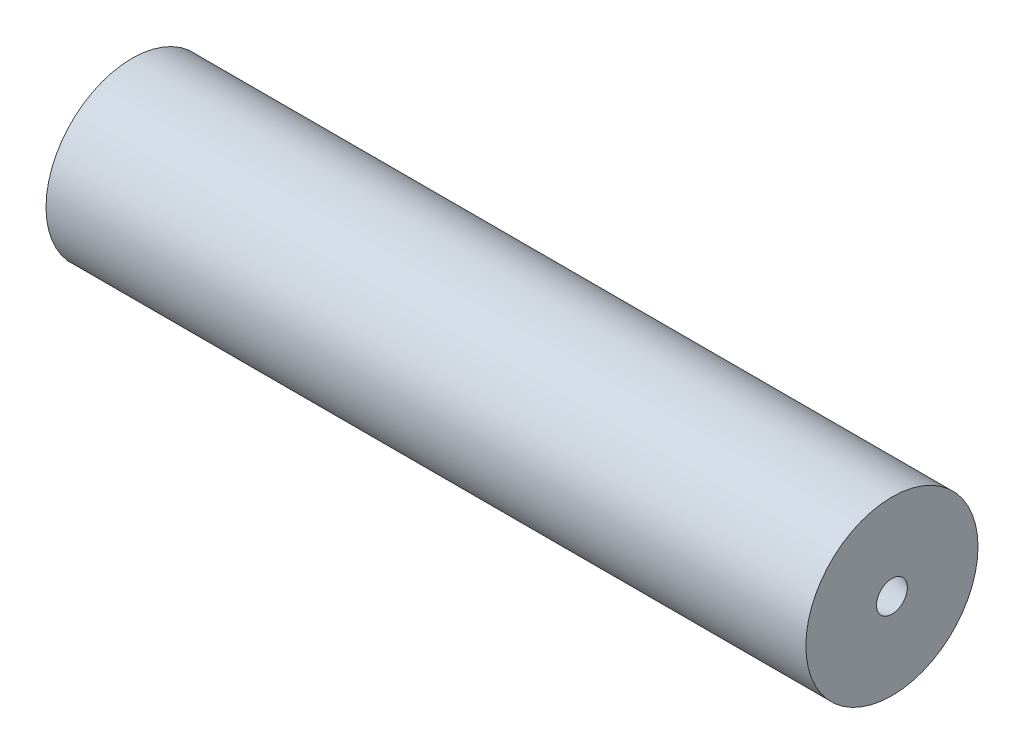
ISO-10303-21;
HEADER;
FILE_DESCRIPTION(('STEP AP214'),'2;1');
FILE_NAME('part.step','',(''),(''),'','','');
FILE_SCHEMA(('AUTOMOTIVE_DESIGN { 1 0 10303 214 1 1 1 1 }'));
ENDSEC;
DATA;
#1=APPLICATION_CONTEXT('core data for automotive mechanical design processes');
#2=APPLICATION_PROTOCOL_DEFINITION('international standard','automotive_design',2000,#1);
#3=PRODUCT_CONTEXT('',#1,'mechanical');
#4=PRODUCT('Part','Part','',(#3));
#5=PRODUCT_RELATED_PRODUCT_CATEGORY('part','',(#4));
#6=PRODUCT_DEFINITION_FORMATION('','',#4);
#7=PRODUCT_DEFINITION_CONTEXT('part definition',#1,'design');
#8=PRODUCT_DEFINITION('design','',#6,#7);
#9=PRODUCT_DEFINITION_SHAPE('','',#8);
#10=(LENGTH_UNIT() NAMED_UNIT(*) SI_UNIT(.MILLI.,.METRE.));
#11=(NAMED_UNIT(*) PLANE_ANGLE_UNIT() SI_UNIT($,.RADIAN.));
#12=(NAMED_UNIT(*) SI_UNIT($,.STERADIAN.) SOLID_ANGLE_UNIT());
#13=UNCERTAINTY_MEASURE_WITH_UNIT(LENGTH_MEASURE(1.E-05),#10,'distance_accuracy_value','');
#14=(GEOMETRIC_REPRESENTATION_CONTEXT(3) GLOBAL_UNCERTAINTY_ASSIGNED_CONTEXT((#13)) GLOBAL_UNIT_ASSIGNED_CONTEXT((#10,
#11,#12)) REPRESENTATION_CONTEXT('',''));
#15=CARTESIAN_POINT('',(0.,0.,0.));
#16=DIRECTION('',(0.,0.,1.));
#17=DIRECTION('',(1.,0.,0.));
#18=AXIS2_PLACEMENT_3D('',#15,#16,#17);
#19=CARTESIAN_POINT('',(0.,12.7,0.));
#20=DIRECTION('',(1.,0.,0.));
#21=DIRECTION('',(0.,0.,-1.));
#22=AXIS2_PLACEMENT_3D('',#19,#20,#21);
#23=PLANE('',#22);
#24=CARTESIAN_POINT('',(0.,0.,0.));
#25=DIRECTION('',(-1.,0.,0.));
#26=DIRECTION('',(0.,0.,1.));
#27=AXIS2_PLACEMENT_3D('',#24,#25,#26);
#28=CIRCLE('',#27,12.7);
#29=CARTESIAN_POINT('',(0.,0.,12.7));
#30=VERTEX_POINT('',#29);
#31=EDGE_CURVE('E10',#30,#30,#28,.T.);
#32=ORIENTED_EDGE('',*,*,#31,.F.);
#33=EDGE_LOOP('',(#32));
#34=FACE_BOUND('',#33,.T.);
#35=CARTESIAN_POINT('',(0.,0.,0.));
#36=DIRECTION('',(-1.,0.,0.));
#37=DIRECTION('',(0.,0.,1.));
#38=AXIS2_PLACEMENT_3D('',#35,#36,#37);
#39=CIRCLE('',#38,31.);
#40=CARTESIAN_POINT('',(0.,0.,31.));
#41=VERTEX_POINT('',#40);
#42=EDGE_CURVE('E65',#41,#41,#39,.T.);
#43=ORIENTED_EDGE('',*,*,#42,.T.);
#44=EDGE_LOOP('',(#43));
#45=FACE_BOUND('',#44,.T.);
#46=ADVANCED_FACE('F37',(#34,#45),#23,.F.);
#47=CARTESIAN_POINT('',(0.,0.,0.));
#48=DIRECTION('',(-1.,0.,0.));
#49=DIRECTION('',(0.,0.,1.));
#50=AXIS2_PLACEMENT_3D('',#47,#48,#49);
#51=CYLINDRICAL_SURFACE('',#50,12.7);
#52=CARTESIAN_POINT('',(196.85,0.,0.));
#53=DIRECTION('',(-1.,0.,0.));
#54=DIRECTION('',(0.,0.,1.));
#55=AXIS2_PLACEMENT_3D('',#52,#53,#54);
#56=CIRCLE('',#55,12.7);
#57=CARTESIAN_POINT('',(196.85,0.,12.7));
#58=VERTEX_POINT('',#57);
#59=EDGE_CURVE('E43',#58,#58,#56,.T.);
#60=ORIENTED_EDGE('',*,*,#59,.F.);
#61=EDGE_LOOP('',(#60));
#62=FACE_BOUND('',#61,.T.);
#63=ORIENTED_EDGE('',*,*,#31,.T.);
#64=EDGE_LOOP('',(#63));
#65=FACE_BOUND('',#64,.T.);
#66=ADVANCED_FACE('F153',(#62,#65),#51,.F.);
#67=CARTESIAN_POINT('',(196.85,12.7,0.));
#68=DIRECTION('',(-1.,0.,0.));
#69=DIRECTION('',(0.,0.,1.));
#70=AXIS2_PLACEMENT_3D('',#67,#68,#69);
#71=PLANE('',#70);
#72=CARTESIAN_POINT('',(196.85,0.,0.));
#73=DIRECTION('',(-1.,0.,0.));
#74=DIRECTION('',(0.,0.,1.));
#75=AXIS2_PLACEMENT_3D('',#72,#73,#74);
#76=CIRCLE('',#75,26.162);
#77=CARTESIAN_POINT('',(196.85,0.,26.162));
#78=VERTEX_POINT('',#77);
#79=EDGE_CURVE('E47',#78,#78,#76,.T.);
#80=ORIENTED_EDGE('',*,*,#79,.F.);
#81=EDGE_LOOP('',(#80));
#82=FACE_BOUND('',#81,.T.);
#83=ORIENTED_EDGE('',*,*,#59,.T.);
#84=EDGE_LOOP('',(#83));
#85=FACE_BOUND('',#84,.T.);
#86=ADVANCED_FACE('F158',(#82,#85),#71,.F.);
#87=CARTESIAN_POINT('',(0.,0.,0.));
#88=DIRECTION('',(-1.,0.,0.));
#89=DIRECTION('',(0.,0.,1.));
#90=AXIS2_PLACEMENT_3D('',#87,#88,#89);
#91=CYLINDRICAL_SURFACE('',#90,26.162);
#92=CARTESIAN_POINT('',(241.3,0.,0.));
#93=DIRECTION('',(-1.,0.,0.));
#94=DIRECTION('',(0.,0.,1.));
#95=AXIS2_PLACEMENT_3D('',#92,#93,#94);
#96=CIRCLE('',#95,26.162);
#97=CARTESIAN_POINT('',(241.3,0.,26.162));
#98=VERTEX_POINT('',#97);
#99=EDGE_CURVE('E51',#98,#98,#96,.T.);
#100=ORIENTED_EDGE('',*,*,#99,.F.);
#101=EDGE_LOOP('',(#100));
#102=FACE_BOUND('',#101,.T.);
#103=ORIENTED_EDGE('',*,*,#79,.T.);
#104=EDGE_LOOP('',(#103));
#105=FACE_BOUND('',#104,.T.);
#106=ADVANCED_FACE('F207',(#102,#105),#91,.F.);
#107=CARTESIAN_POINT('',(241.3,26.162,0.));
#108=DIRECTION('',(1.,0.,0.));
#109=DIRECTION('',(0.,0.,-1.));
#110=AXIS2_PLACEMENT_3D('',#107,#108,#109);
#111=PLANE('',#110);
#112=CARTESIAN_POINT('',(241.3,6.477,0.));
#113=DIRECTION('',(-1.,0.,0.));
#114=DIRECTION('',(0.,0.,1.));
#115=AXIS2_PLACEMENT_3D('',#112,#113,#114);
#116=CIRCLE('',#115,0.80645);
#117=CARTESIAN_POINT('',(241.3,6.477,0.80645));
#118=VERTEX_POINT('',#117);
#119=EDGE_CURVE('E111',#118,#118,#116,.T.);
#120=ORIENTED_EDGE('',*,*,#119,.F.);
#121=EDGE_LOOP('',(#120));
#122=FACE_BOUND('',#121,.T.);
#123=CARTESIAN_POINT('',(241.3,4.57993062174566,4.57993062174543));
#124=DIRECTION('',(-1.,0.,0.));
#125=DIRECTION('',(0.,0.,1.));
#126=AXIS2_PLACEMENT_3D('',#123,#124,#125);
#127=CIRCLE('',#126,0.806450000000051);
#128=CARTESIAN_POINT('',(241.3,4.57993062174566,5.38638062174548));
#129=VERTEX_POINT('',#128);
#130=EDGE_CURVE('E105',#129,#129,#127,.T.);
#131=ORIENTED_EDGE('',*,*,#130,.F.);
#132=EDGE_LOOP('',(#131));
#133=FACE_BOUND('',#132,.T.);
#134=CARTESIAN_POINT('',(241.3,5.51072430344469E-13,6.47700000000055));
#135=DIRECTION('',(-1.,0.,0.));
#136=DIRECTION('',(0.,0.,1.));
#137=AXIS2_PLACEMENT_3D('',#134,#135,#136);
#138=CIRCLE('',#137,0.806450000000388);
#139=CARTESIAN_POINT('',(241.3,5.51072430344469E-13,7.28345000000094));
#140=VERTEX_POINT('',#139);
#141=EDGE_CURVE('E99',#140,#140,#138,.T.);
#142=ORIENTED_EDGE('',*,*,#141,.F.);
#143=EDGE_LOOP('',(#142));
#144=FACE_BOUND('',#143,.T.);
#145=CARTESIAN_POINT('',(241.3,-4.57993062174488,4.57993062174621));
#146=DIRECTION('',(-1.,0.,0.));
#147=DIRECTION('',(0.,0.,1.));
#148=AXIS2_PLACEMENT_3D('',#145,#146,#147);
#149=CIRCLE('',#148,0.806450000000818);
#150=CARTESIAN_POINT('',(241.3,-4.57993062174488,5.38638062174703));
#151=VERTEX_POINT('',#150);
#152=EDGE_CURVE('E93',#151,#151,#149,.T.);
#153=ORIENTED_EDGE('',*,*,#152,.F.);
#154=EDGE_LOOP('',(#153));
#155=FACE_BOUND('',#154,.T.);
#156=CARTESIAN_POINT('',(241.3,-6.477,1.10214486068894E-12));
#157=DIRECTION('',(-1.,0.,0.));
#158=DIRECTION('',(0.,0.,1.));
#159=AXIS2_PLACEMENT_3D('',#156,#157,#158);
#160=CIRCLE('',#159,0.806450000001097);
#161=CARTESIAN_POINT('',(241.3,-6.477,0.806450000002199));
#162=VERTEX_POINT('',#161);
#163=EDGE_CURVE('E87',#162,#162,#160,.T.);
#164=ORIENTED_EDGE('',*,*,#163,.F.);
#165=EDGE_LOOP('',(#164));
#166=FACE_BOUND('',#165,.T.);
#167=CARTESIAN_POINT('',(241.3,-4.57993062174566,-4.57993062174433));
#168=DIRECTION('',(-1.,0.,0.));
#169=DIRECTION('',(0.,0.,1.));
#170=AXIS2_PLACEMENT_3D('',#167,#168,#169);
#171=CIRCLE('',#170,0.806450000001067);
#172=CARTESIAN_POINT('',(241.3,-4.57993062174566,-3.77348062174326));
#173=VERTEX_POINT('',#172);
#174=EDGE_CURVE('E81',#173,#173,#171,.T.);
#175=ORIENTED_EDGE('',*,*,#174,.F.);
#176=EDGE_LOOP('',(#175));
#177=FACE_BOUND('',#176,.T.);
#178=CARTESIAN_POINT('',(241.3,-5.51865634076276E-13,-6.47699999999945));
#179=DIRECTION('',(-1.,0.,0.));
#180=DIRECTION('',(0.,0.,1.));
#181=AXIS2_PLACEMENT_3D('',#178,#179,#180);
#182=CIRCLE('',#181,0.806450000000754);
#183=CARTESIAN_POINT('',(241.3,-5.51865634076276E-13,-5.6705499999987));
#184=VERTEX_POINT('',#183);
#185=EDGE_CURVE('E75',#184,#184,#182,.T.);
#186=ORIENTED_EDGE('',*,*,#185,.F.);
#187=EDGE_LOOP('',(#186));
#188=FACE_BOUND('',#187,.T.);
#189=CARTESIAN_POINT('',(241.3,4.57993062174488,-4.57993062174511));
#190=DIRECTION('',(-1.,0.,0.));
#191=DIRECTION('',(0.,0.,1.));
#192=AXIS2_PLACEMENT_3D('',#189,#190,#191);
#193=CIRCLE('',#192,0.806450000000345);
#194=CARTESIAN_POINT('',(241.3,4.57993062174488,-3.77348062174476));
#195=VERTEX_POINT('',#194);
#196=EDGE_CURVE('E69',#195,#195,#193,.T.);
#197=ORIENTED_EDGE('',*,*,#196,.F.);
#198=EDGE_LOOP('',(#197));
#199=FACE_BOUND('',#198,.T.);
#200=ORIENTED_EDGE('',*,*,#99,.T.);
#201=EDGE_LOOP('',(#200));
#202=FACE_BOUND('',#201,.T.);
#203=ADVANCED_FACE('F123',(#122,#133,#144,#155,#166,#177,#188,#199,#202),#111,.F.);
#204=CARTESIAN_POINT('',(259.36,10.7696,0.));
#205=DIRECTION('',(-1.,0.,0.));
#206=DIRECTION('',(0.,0.,1.));
#207=AXIS2_PLACEMENT_3D('',#204,#205,#206);
#208=PLANE('',#207);
#209=CARTESIAN_POINT('',(259.36,6.477,0.));
#210=DIRECTION('',(-1.,0.,0.));
#211=DIRECTION('',(0.,0.,1.));
#212=AXIS2_PLACEMENT_3D('',#209,#210,#211);
#213=CIRCLE('',#212,0.80645);
#214=CARTESIAN_POINT('',(259.36,6.477,0.80645));
#215=VERTEX_POINT('',#214);
#216=EDGE_CURVE('E68',#215,#215,#213,.F.);
#217=ORIENTED_EDGE('',*,*,#216,.F.);
#218=EDGE_LOOP('',(#217));
#219=FACE_BOUND('',#218,.T.);
#220=CARTESIAN_POINT('',(259.36,4.57993062174566,4.57993062174543));
#221=DIRECTION('',(-1.,0.,0.));
#222=DIRECTION('',(0.,0.,1.));
#223=AXIS2_PLACEMENT_3D('',#220,#221,#222);
#224=CIRCLE('',#223,0.806450000000051);
#225=CARTESIAN_POINT('',(259.36,4.57993062174566,5.38638062174548));
#226=VERTEX_POINT('',#225);
#227=EDGE_CURVE('E108',#226,#226,#224,.F.);
#228=ORIENTED_EDGE('',*,*,#227,.F.);
#229=EDGE_LOOP('',(#228));
#230=FACE_BOUND('',#229,.T.);
#231=CARTESIAN_POINT('',(259.36,5.51072430344469E-13,6.47700000000055));
#232=DIRECTION('',(-1.,0.,0.));
#233=DIRECTION('',(0.,0.,1.));
#234=AXIS2_PLACEMENT_3D('',#231,#232,#233);
#235=CIRCLE('',#234,0.806450000000388);
#236=CARTESIAN_POINT('',(259.36,5.51072430344469E-13,7.28345000000094));
#237=VERTEX_POINT('',#236);
#238=EDGE_CURVE('E102',#237,#237,#235,.F.);
#239=ORIENTED_EDGE('',*,*,#238,.F.);
#240=EDGE_LOOP('',(#239));
#241=FACE_BOUND('',#240,.T.);
#242=CARTESIAN_POINT('',(259.36,-4.57993062174488,4.57993062174621));
#243=DIRECTION('',(-1.,0.,0.));
#244=DIRECTION('',(0.,0.,1.));
#245=AXIS2_PLACEMENT_3D('',#242,#243,#244);
#246=CIRCLE('',#245,0.806450000000818);
#247=CARTESIAN_POINT('',(259.36,-4.57993062174488,5.38638062174703));
#248=VERTEX_POINT('',#247);
#249=EDGE_CURVE('E96',#248,#248,#246,.F.);
#250=ORIENTED_EDGE('',*,*,#249,.F.);
#251=EDGE_LOOP('',(#250));
#252=FACE_BOUND('',#251,.T.);
#253=CARTESIAN_POINT('',(259.36,-6.477,1.10214486068894E-12));
#254=DIRECTION('',(-1.,0.,0.));
#255=DIRECTION('',(0.,0.,1.));
#256=AXIS2_PLACEMENT_3D('',#253,#254,#255);
#257=CIRCLE('',#256,0.806450000001097);
#258=CARTESIAN_POINT('',(259.36,-6.477,0.806450000002199));
#259=VERTEX_POINT('',#258);
#260=EDGE_CURVE('E90',#259,#259,#257,.F.);
#261=ORIENTED_EDGE('',*,*,#260,.F.);
#262=EDGE_LOOP('',(#261));
#263=FACE_BOUND('',#262,.T.);
#264=CARTESIAN_POINT('',(259.36,-4.57993062174566,-4.57993062174433));
#265=DIRECTION('',(-1.,0.,0.));
#266=DIRECTION('',(0.,0.,1.));
#267=AXIS2_PLACEMENT_3D('',#264,#265,#266);
#268=CIRCLE('',#267,0.806450000001067);
#269=CARTESIAN_POINT('',(259.36,-4.57993062174566,-3.77348062174326));
#270=VERTEX_POINT('',#269);
#271=EDGE_CURVE('E84',#270,#270,#268,.F.);
#272=ORIENTED_EDGE('',*,*,#271,.F.);
#273=EDGE_LOOP('',(#272));
#274=FACE_BOUND('',#273,.T.);
#275=CARTESIAN_POINT('',(259.36,-5.51865634076276E-13,-6.47699999999945));
#276=DIRECTION('',(-1.,0.,0.));
#277=DIRECTION('',(0.,0.,1.));
#278=AXIS2_PLACEMENT_3D('',#275,#276,#277);
#279=CIRCLE('',#278,0.806450000000754);
#280=CARTESIAN_POINT('',(259.36,-5.51865634076276E-13,-5.6705499999987));
#281=VERTEX_POINT('',#280);
#282=EDGE_CURVE('E78',#281,#281,#279,.F.);
#283=ORIENTED_EDGE('',*,*,#282,.F.);
#284=EDGE_LOOP('',(#283));
#285=FACE_BOUND('',#284,.T.);
#286=CARTESIAN_POINT('',(259.36,4.57993062174488,-4.57993062174511));
#287=DIRECTION('',(-1.,0.,0.));
#288=DIRECTION('',(0.,0.,1.));
#289=AXIS2_PLACEMENT_3D('',#286,#287,#288);
#290=CIRCLE('',#289,0.806450000000345);
#291=CARTESIAN_POINT('',(259.36,4.57993062174488,-3.77348062174476));
#292=VERTEX_POINT('',#291);
#293=EDGE_CURVE('E72',#292,#292,#290,.F.);
#294=ORIENTED_EDGE('',*,*,#293,.F.);
#295=EDGE_LOOP('',(#294));
#296=FACE_BOUND('',#295,.T.);
#297=CARTESIAN_POINT('',(259.36,0.,0.));
#298=DIRECTION('',(-1.,0.,0.));
#299=DIRECTION('',(0.,0.,1.));
#300=AXIS2_PLACEMENT_3D('',#297,#298,#299);
#301=CIRCLE('',#300,10.7696);
#302=CARTESIAN_POINT('',(259.36,0.,10.7696));
#303=VERTEX_POINT('',#302);
#304=EDGE_CURVE('E56',#303,#303,#301,.T.);
#305=ORIENTED_EDGE('',*,*,#304,.F.);
#306=EDGE_LOOP('',(#305));
#307=FACE_BOUND('',#306,.T.);
#308=ADVANCED_FACE('F119',(#219,#230,#241,#252,#263,#274,#285,#296,#307),#208,.F.);
#309=CARTESIAN_POINT('',(259.36,0.,0.));
#310=DIRECTION('',(-1.,0.,0.));
#311=DIRECTION('',(0.,0.,1.));
#312=AXIS2_PLACEMENT_3D('',#309,#310,#311);
#313=CONICAL_SURFACE('',#312,10.7696,0.349066185653854);
#314=CARTESIAN_POINT('',(273.6661,0.,0.));
#315=DIRECTION('',(-1.,0.,0.));
#316=DIRECTION('',(0.,0.,1.));
#317=AXIS2_PLACEMENT_3D('',#314,#315,#316);
#318=CIRCLE('',#317,5.5626);
#319=CARTESIAN_POINT('',(273.6661,0.,5.5626));
#320=VERTEX_POINT('',#319);
#321=EDGE_CURVE('E59',#320,#320,#318,.T.);
#322=ORIENTED_EDGE('',*,*,#321,.F.);
#323=EDGE_LOOP('',(#322));
#324=FACE_BOUND('',#323,.T.);
#325=ORIENTED_EDGE('',*,*,#304,.T.);
#326=EDGE_LOOP('',(#325));
#327=FACE_BOUND('',#326,.T.);
#328=ADVANCED_FACE('F122',(#324,#327),#313,.F.);
#329=CARTESIAN_POINT('',(273.6661,5.5626,0.));
#330=DIRECTION('',(-1.,0.,0.));
#331=DIRECTION('',(0.,0.,1.));
#332=AXIS2_PLACEMENT_3D('',#329,#330,#331);
#333=PLANE('',#332);
#334=CARTESIAN_POINT('',(273.6661,0.,0.));
#335=DIRECTION('',(-1.,0.,0.));
#336=DIRECTION('',(0.,0.,1.));
#337=AXIS2_PLACEMENT_3D('',#334,#335,#336);
#338=CIRCLE('',#337,31.);
#339=CARTESIAN_POINT('',(273.6661,0.,31.));
#340=VERTEX_POINT('',#339);
#341=EDGE_CURVE('E62',#340,#340,#338,.T.);
#342=ORIENTED_EDGE('',*,*,#341,.F.);
#343=EDGE_LOOP('',(#342));
#344=FACE_BOUND('',#343,.T.);
#345=ORIENTED_EDGE('',*,*,#321,.T.);
#346=EDGE_LOOP('',(#345));
#347=FACE_BOUND('',#346,.T.);
#348=ADVANCED_FACE('F142',(#344,#347),#333,.F.);
#349=CARTESIAN_POINT('',(0.,0.,0.));
#350=DIRECTION('',(-1.,0.,0.));
#351=DIRECTION('',(0.,0.,1.));
#352=AXIS2_PLACEMENT_3D('',#349,#350,#351);
#353=CYLINDRICAL_SURFACE('',#352,31.);
#354=ORIENTED_EDGE('',*,*,#42,.F.);
#355=EDGE_LOOP('',(#354));
#356=FACE_BOUND('',#355,.T.);
#357=ORIENTED_EDGE('',*,*,#341,.T.);
#358=EDGE_LOOP('',(#357));
#359=FACE_BOUND('',#358,.T.);
#360=ADVANCED_FACE('F148',(#356,#359),#353,.T.);
#361=CARTESIAN_POINT('',(273.6671,4.57993062174488,-4.57993062174511));
#362=DIRECTION('',(-1.,0.,0.));
#363=DIRECTION('',(0.,0.,1.));
#364=AXIS2_PLACEMENT_3D('',#361,#362,#363);
#365=CYLINDRICAL_SURFACE('',#364,0.806450000000345);
#366=ORIENTED_EDGE('',*,*,#196,.T.);
#367=EDGE_LOOP('',(#366));
#368=FACE_BOUND('',#367,.T.);
#369=ORIENTED_EDGE('',*,*,#293,.T.);
#370=EDGE_LOOP('',(#369));
#371=FACE_BOUND('',#370,.T.);
#372=ADVANCED_FACE('F165',(#368,#371),#365,.F.);
#373=CARTESIAN_POINT('',(273.6671,-5.51865634076276E-13,-6.47699999999945));
#374=DIRECTION('',(-1.,0.,0.));
#375=DIRECTION('',(0.,0.,1.));
#376=AXIS2_PLACEMENT_3D('',#373,#374,#375);
#377=CYLINDRICAL_SURFACE('',#376,0.806450000000754);
#378=ORIENTED_EDGE('',*,*,#185,.T.);
#379=EDGE_LOOP('',(#378));
#380=FACE_BOUND('',#379,.T.);
#381=ORIENTED_EDGE('',*,*,#282,.T.);
#382=EDGE_LOOP('',(#381));
#383=FACE_BOUND('',#382,.T.);
#384=ADVANCED_FACE('F172',(#380,#383),#377,.F.);
#385=CARTESIAN_POINT('',(273.6671,-4.57993062174566,-4.57993062174433));
#386=DIRECTION('',(-1.,0.,0.));
#387=DIRECTION('',(0.,0.,1.));
#388=AXIS2_PLACEMENT_3D('',#385,#386,#387);
#389=CYLINDRICAL_SURFACE('',#388,0.806450000001067);
#390=ORIENTED_EDGE('',*,*,#174,.T.);
#391=EDGE_LOOP('',(#390));
#392=FACE_BOUND('',#391,.T.);
#393=ORIENTED_EDGE('',*,*,#271,.T.);
#394=EDGE_LOOP('',(#393));
#395=FACE_BOUND('',#394,.T.);
#396=ADVANCED_FACE('F178',(#392,#395),#389,.F.);
#397=CARTESIAN_POINT('',(273.6671,-6.477,1.10214486068894E-12));
#398=DIRECTION('',(-1.,0.,0.));
#399=DIRECTION('',(0.,0.,1.));
#400=AXIS2_PLACEMENT_3D('',#397,#398,#399);
#401=CYLINDRICAL_SURFACE('',#400,0.806450000001097);
#402=ORIENTED_EDGE('',*,*,#163,.T.);
#403=EDGE_LOOP('',(#402));
#404=FACE_BOUND('',#403,.T.);
#405=ORIENTED_EDGE('',*,*,#260,.T.);
#406=EDGE_LOOP('',(#405));
#407=FACE_BOUND('',#406,.T.);
#408=ADVANCED_FACE('F182',(#404,#407),#401,.F.);
#409=CARTESIAN_POINT('',(273.6671,-4.57993062174488,4.57993062174621));
#410=DIRECTION('',(-1.,0.,0.));
#411=DIRECTION('',(0.,0.,1.));
#412=AXIS2_PLACEMENT_3D('',#409,#410,#411);
#413=CYLINDRICAL_SURFACE('',#412,0.806450000000818);
#414=ORIENTED_EDGE('',*,*,#152,.T.);
#415=EDGE_LOOP('',(#414));
#416=FACE_BOUND('',#415,.T.);
#417=ORIENTED_EDGE('',*,*,#249,.T.);
#418=EDGE_LOOP('',(#417));
#419=FACE_BOUND('',#418,.T.);
#420=ADVANCED_FACE('F186',(#416,#419),#413,.F.);
#421=CARTESIAN_POINT('',(273.6671,5.51072430344469E-13,6.47700000000055));
#422=DIRECTION('',(-1.,0.,0.));
#423=DIRECTION('',(0.,0.,1.));
#424=AXIS2_PLACEMENT_3D('',#421,#422,#423);
#425=CYLINDRICAL_SURFACE('',#424,0.806450000000388);
#426=ORIENTED_EDGE('',*,*,#141,.T.);
#427=EDGE_LOOP('',(#426));
#428=FACE_BOUND('',#427,.T.);
#429=ORIENTED_EDGE('',*,*,#238,.T.);
#430=EDGE_LOOP('',(#429));
#431=FACE_BOUND('',#430,.T.);
#432=ADVANCED_FACE('F190',(#428,#431),#425,.F.);
#433=CARTESIAN_POINT('',(273.6671,4.57993062174566,4.57993062174543));
#434=DIRECTION('',(-1.,0.,0.));
#435=DIRECTION('',(0.,0.,1.));
#436=AXIS2_PLACEMENT_3D('',#433,#434,#435);
#437=CYLINDRICAL_SURFACE('',#436,0.806450000000051);
#438=ORIENTED_EDGE('',*,*,#130,.T.);
#439=EDGE_LOOP('',(#438));
#440=FACE_BOUND('',#439,.T.);
#441=ORIENTED_EDGE('',*,*,#227,.T.);
#442=EDGE_LOOP('',(#441));
#443=FACE_BOUND('',#442,.T.);
#444=ADVANCED_FACE('F194',(#440,#443),#437,.F.);
#445=CARTESIAN_POINT('',(273.6671,6.477,0.));
#446=DIRECTION('',(-1.,0.,0.));
#447=DIRECTION('',(0.,0.,1.));
#448=AXIS2_PLACEMENT_3D('',#445,#446,#447);
#449=CYLINDRICAL_SURFACE('',#448,0.80645);
#450=ORIENTED_EDGE('',*,*,#119,.T.);
#451=EDGE_LOOP('',(#450));
#452=FACE_BOUND('',#451,.T.);
#453=ORIENTED_EDGE('',*,*,#216,.T.);
#454=EDGE_LOOP('',(#453));
#455=FACE_BOUND('',#454,.T.);
#456=ADVANCED_FACE('F117',(#452,#455),#449,.F.);
#457=CLOSED_SHELL('',(#46,#66,#86,#106,#203,#308,#328,#348,#360,#372,#384,#396,#408,#420,#432,
#444,#456));
#458=MANIFOLD_SOLID_BREP('B2',#457);
#459=ADVANCED_BREP_SHAPE_REPRESENTATION('',(#18,#458),#14);
#460=SHAPE_DEFINITION_REPRESENTATION(#9,#459);
ENDSEC;
END-ISO-10303-21;
